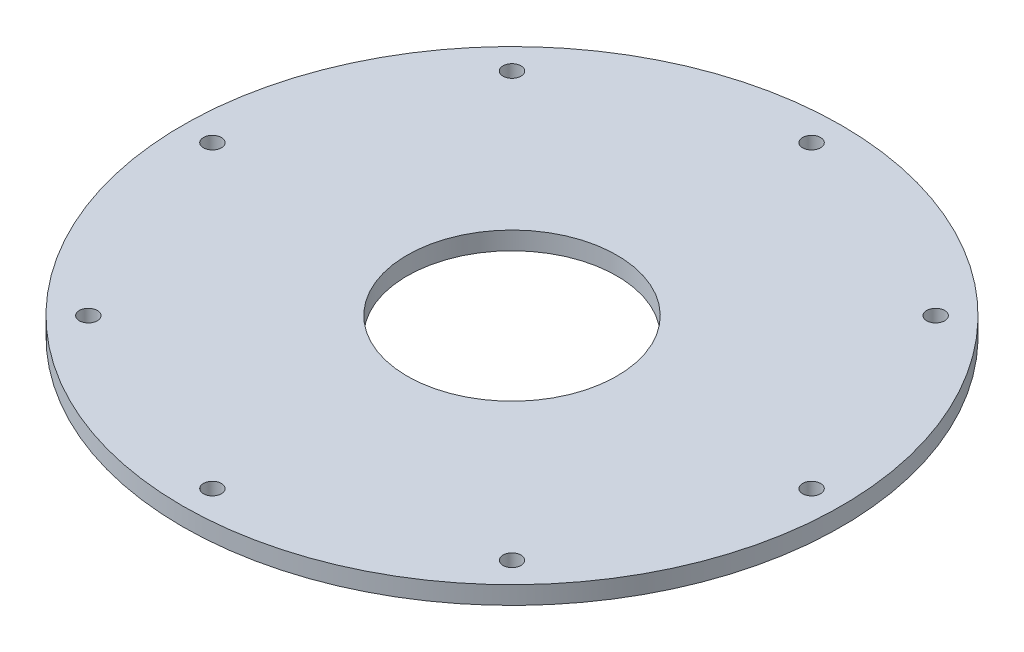
ISO-10303-21;
HEADER;
FILE_DESCRIPTION(('STEP AP214'),'2;1');
FILE_NAME('part.step','',(''),(''),'','','');
FILE_SCHEMA(('AUTOMOTIVE_DESIGN { 1 0 10303 214 1 1 1 1 }'));
ENDSEC;
DATA;
#1=APPLICATION_CONTEXT('core data for automotive mechanical design processes');
#2=APPLICATION_PROTOCOL_DEFINITION('international standard','automotive_design',2000,#1);
#3=PRODUCT_CONTEXT('',#1,'mechanical');
#4=PRODUCT('Part','Part','',(#3));
#5=PRODUCT_RELATED_PRODUCT_CATEGORY('part','',(#4));
#6=PRODUCT_DEFINITION_FORMATION('','',#4);
#7=PRODUCT_DEFINITION_CONTEXT('part definition',#1,'design');
#8=PRODUCT_DEFINITION('design','',#6,#7);
#9=PRODUCT_DEFINITION_SHAPE('','',#8);
#10=(LENGTH_UNIT() NAMED_UNIT(*) SI_UNIT(.MILLI.,.METRE.));
#11=(NAMED_UNIT(*) PLANE_ANGLE_UNIT() SI_UNIT($,.RADIAN.));
#12=(NAMED_UNIT(*) SI_UNIT($,.STERADIAN.) SOLID_ANGLE_UNIT());
#13=UNCERTAINTY_MEASURE_WITH_UNIT(LENGTH_MEASURE(1.E-05),#10,'distance_accuracy_value','');
#14=(GEOMETRIC_REPRESENTATION_CONTEXT(3) GLOBAL_UNCERTAINTY_ASSIGNED_CONTEXT((#13)) GLOBAL_UNIT_ASSIGNED_CONTEXT((#10,
#11,#12)) REPRESENTATION_CONTEXT('',''));
#15=CARTESIAN_POINT('',(0.,0.,0.));
#16=DIRECTION('',(0.,0.,1.));
#17=DIRECTION('',(1.,0.,0.));
#18=AXIS2_PLACEMENT_3D('',#15,#16,#17);
#19=CARTESIAN_POINT('',(0.,3.,0.));
#20=DIRECTION('',(0.,-1.,0.));
#21=DIRECTION('',(0.,0.,-1.));
#22=AXIS2_PLACEMENT_3D('',#19,#20,#21);
#23=CYLINDRICAL_SURFACE('',#22,55.);
#24=CARTESIAN_POINT('',(0.,3.,0.));
#25=DIRECTION('',(0.,1.,0.));
#26=DIRECTION('',(0.,0.,1.));
#27=AXIS2_PLACEMENT_3D('',#24,#25,#26);
#28=CIRCLE('',#27,55.);
#29=CARTESIAN_POINT('',(0.,3.,55.));
#30=VERTEX_POINT('',#29);
#31=EDGE_CURVE('E10',#30,#30,#28,.T.);
#32=ORIENTED_EDGE('',*,*,#31,.F.);
#33=EDGE_LOOP('',(#32));
#34=FACE_BOUND('',#33,.T.);
#35=CARTESIAN_POINT('',(0.,0.,0.));
#36=DIRECTION('',(0.,1.,0.));
#37=DIRECTION('',(0.,0.,1.));
#38=AXIS2_PLACEMENT_3D('',#35,#36,#37);
#39=CIRCLE('',#38,55.);
#40=CARTESIAN_POINT('',(0.,0.,55.));
#41=VERTEX_POINT('',#40);
#42=EDGE_CURVE('E46',#41,#41,#39,.T.);
#43=ORIENTED_EDGE('',*,*,#42,.T.);
#44=EDGE_LOOP('',(#43));
#45=FACE_BOUND('',#44,.T.);
#46=ADVANCED_FACE('F43',(#34,#45),#23,.T.);
#47=CARTESIAN_POINT('',(0.,3.,0.));
#48=DIRECTION('',(0.,1.,0.));
#49=DIRECTION('',(0.,0.,1.));
#50=AXIS2_PLACEMENT_3D('',#47,#48,#49);
#51=PLANE('',#50);
#52=CARTESIAN_POINT('',(-50.,3.,1.74574066942157E-13));
#53=DIRECTION('',(0.,1.,0.));
#54=DIRECTION('',(1.,0.,0.));
#55=AXIS2_PLACEMENT_3D('',#52,#53,#54);
#56=CIRCLE('',#55,1.5);
#57=CARTESIAN_POINT('',(-48.5,3.,1.69336844933892E-13));
#58=VERTEX_POINT('',#57);
#59=EDGE_CURVE('E106',#58,#58,#56,.T.);
#60=ORIENTED_EDGE('',*,*,#59,.F.);
#61=EDGE_LOOP('',(#60));
#62=FACE_BOUND('',#61,.T.);
#63=CARTESIAN_POINT('',(-35.3553390593272,3.,35.3553390593276));
#64=DIRECTION('',(0.,1.,0.));
#65=DIRECTION('',(0.707106781186544,0.,-0.707106781186551));
#66=AXIS2_PLACEMENT_3D('',#63,#64,#65);
#67=CIRCLE('',#66,1.5);
#68=CARTESIAN_POINT('',(-34.2946788875474,3.,34.2946788875477));
#69=VERTEX_POINT('',#68);
#70=EDGE_CURVE('E98',#69,#69,#67,.T.);
#71=ORIENTED_EDGE('',*,*,#70,.F.);
#72=EDGE_LOOP('',(#71));
#73=FACE_BOUND('',#72,.T.);
#74=CARTESIAN_POINT('',(0.,3.,50.));
#75=DIRECTION('',(0.,1.,0.));
#76=DIRECTION('',(0.,0.,-1.));
#77=AXIS2_PLACEMENT_3D('',#74,#75,#76);
#78=CIRCLE('',#77,1.5);
#79=CARTESIAN_POINT('',(0.,3.,48.5));
#80=VERTEX_POINT('',#79);
#81=EDGE_CURVE('E90',#80,#80,#78,.T.);
#82=ORIENTED_EDGE('',*,*,#81,.F.);
#83=EDGE_LOOP('',(#82));
#84=FACE_BOUND('',#83,.T.);
#85=CARTESIAN_POINT('',(35.3553390593277,3.,35.3553390593271));
#86=DIRECTION('',(0.,1.,0.));
#87=DIRECTION('',(-0.707106781186554,0.,-0.707106781186541));
#88=AXIS2_PLACEMENT_3D('',#85,#86,#87);
#89=CIRCLE('',#88,1.5);
#90=CARTESIAN_POINT('',(34.2946788875479,3.,34.2946788875473));
#91=VERTEX_POINT('',#90);
#92=EDGE_CURVE('E81',#91,#91,#89,.T.);
#93=ORIENTED_EDGE('',*,*,#92,.F.);
#94=EDGE_LOOP('',(#93));
#95=FACE_BOUND('',#94,.T.);
#96=CARTESIAN_POINT('',(50.,3.,-5.2372220082647E-13));
#97=DIRECTION('',(0.,1.,0.));
#98=DIRECTION('',(-1.,0.,0.));
#99=AXIS2_PLACEMENT_3D('',#96,#97,#98);
#100=CIRCLE('',#99,1.5);
#101=CARTESIAN_POINT('',(48.5,3.,-5.08010534801676E-13));
#102=VERTEX_POINT('',#101);
#103=EDGE_CURVE('E121',#102,#102,#100,.T.);
#104=ORIENTED_EDGE('',*,*,#103,.F.);
#105=EDGE_LOOP('',(#104));
#106=FACE_BOUND('',#105,.T.);
#107=CARTESIAN_POINT('',(35.3553390593269,3.,-35.3553390593278));
#108=DIRECTION('',(0.,1.,0.));
#109=DIRECTION('',(-0.707106781186539,0.,0.707106781186556));
#110=AXIS2_PLACEMENT_3D('',#107,#108,#109);
#111=CIRCLE('',#110,1.5);
#112=CARTESIAN_POINT('',(34.2946788875471,3.,-34.294678887548));
#113=VERTEX_POINT('',#112);
#114=EDGE_CURVE('E113',#113,#113,#111,.T.);
#115=ORIENTED_EDGE('',*,*,#114,.F.);
#116=EDGE_LOOP('',(#115));
#117=FACE_BOUND('',#116,.T.);
#118=CARTESIAN_POINT('',(-35.3553390593274,3.,-35.3553390593273));
#119=DIRECTION('',(0.,1.,0.));
#120=DIRECTION('',(0.707106781186549,0.,0.707106781186546));
#121=AXIS2_PLACEMENT_3D('',#118,#119,#120);
#122=CIRCLE('',#121,1.5);
#123=CARTESIAN_POINT('',(-34.2946788875476,3.,-34.2946788875475));
#124=VERTEX_POINT('',#123);
#125=EDGE_CURVE('E73',#124,#124,#122,.T.);
#126=ORIENTED_EDGE('',*,*,#125,.F.);
#127=EDGE_LOOP('',(#126));
#128=FACE_BOUND('',#127,.T.);
#129=CARTESIAN_POINT('',(0.,3.,-50.));
#130=DIRECTION('',(0.,1.,0.));
#131=DIRECTION('',(0.,0.,1.));
#132=AXIS2_PLACEMENT_3D('',#129,#130,#131);
#133=CIRCLE('',#132,1.5);
#134=CARTESIAN_POINT('',(0.,3.,-48.5));
#135=VERTEX_POINT('',#134);
#136=EDGE_CURVE('E65',#135,#135,#133,.T.);
#137=ORIENTED_EDGE('',*,*,#136,.F.);
#138=EDGE_LOOP('',(#137));
#139=FACE_BOUND('',#138,.T.);
#140=CARTESIAN_POINT('',(0.,3.,0.));
#141=DIRECTION('',(0.,1.,0.));
#142=DIRECTION('',(0.,0.,1.));
#143=AXIS2_PLACEMENT_3D('',#140,#141,#142);
#144=CIRCLE('',#143,17.5);
#145=CARTESIAN_POINT('',(0.,3.,17.5));
#146=VERTEX_POINT('',#145);
#147=EDGE_CURVE('E57',#146,#146,#144,.T.);
#148=ORIENTED_EDGE('',*,*,#147,.F.);
#149=EDGE_LOOP('',(#148));
#150=FACE_BOUND('',#149,.T.);
#151=ORIENTED_EDGE('',*,*,#31,.T.);
#152=EDGE_LOOP('',(#151));
#153=FACE_BOUND('',#152,.T.);
#154=ADVANCED_FACE('F140',(#62,#73,#84,#95,#106,#117,#128,#139,#150,#153),#51,.T.);
#155=CARTESIAN_POINT('',(0.,0.,0.));
#156=DIRECTION('',(0.,1.,0.));
#157=DIRECTION('',(0.,0.,1.));
#158=AXIS2_PLACEMENT_3D('',#155,#156,#157);
#159=PLANE('',#158);
#160=CARTESIAN_POINT('',(-50.,0.,1.74574066942157E-13));
#161=DIRECTION('',(0.,1.,0.));
#162=DIRECTION('',(1.,0.,0.));
#163=AXIS2_PLACEMENT_3D('',#160,#161,#162);
#164=CIRCLE('',#163,1.5);
#165=CARTESIAN_POINT('',(-48.5,0.,1.69336844933892E-13));
#166=VERTEX_POINT('',#165);
#167=EDGE_CURVE('E77',#166,#166,#164,.T.);
#168=ORIENTED_EDGE('',*,*,#167,.T.);
#169=EDGE_LOOP('',(#168));
#170=FACE_BOUND('',#169,.T.);
#171=CARTESIAN_POINT('',(-35.3553390593272,0.,35.3553390593276));
#172=DIRECTION('',(0.,1.,0.));
#173=DIRECTION('',(0.707106781186544,0.,-0.707106781186551));
#174=AXIS2_PLACEMENT_3D('',#171,#172,#173);
#175=CIRCLE('',#174,1.5);
#176=CARTESIAN_POINT('',(-34.2946788875474,0.,34.2946788875477));
#177=VERTEX_POINT('',#176);
#178=EDGE_CURVE('E102',#177,#177,#175,.T.);
#179=ORIENTED_EDGE('',*,*,#178,.T.);
#180=EDGE_LOOP('',(#179));
#181=FACE_BOUND('',#180,.T.);
#182=CARTESIAN_POINT('',(0.,0.,50.));
#183=DIRECTION('',(0.,1.,0.));
#184=DIRECTION('',(0.,0.,-1.));
#185=AXIS2_PLACEMENT_3D('',#182,#183,#184);
#186=CIRCLE('',#185,1.5);
#187=CARTESIAN_POINT('',(0.,0.,48.5));
#188=VERTEX_POINT('',#187);
#189=EDGE_CURVE('E94',#188,#188,#186,.T.);
#190=ORIENTED_EDGE('',*,*,#189,.T.);
#191=EDGE_LOOP('',(#190));
#192=FACE_BOUND('',#191,.T.);
#193=CARTESIAN_POINT('',(35.3553390593277,0.,35.3553390593271));
#194=DIRECTION('',(0.,1.,0.));
#195=DIRECTION('',(-0.707106781186554,0.,-0.707106781186541));
#196=AXIS2_PLACEMENT_3D('',#193,#194,#195);
#197=CIRCLE('',#196,1.5);
#198=CARTESIAN_POINT('',(34.2946788875479,0.,34.2946788875473));
#199=VERTEX_POINT('',#198);
#200=EDGE_CURVE('E85',#199,#199,#197,.T.);
#201=ORIENTED_EDGE('',*,*,#200,.T.);
#202=EDGE_LOOP('',(#201));
#203=FACE_BOUND('',#202,.T.);
#204=CARTESIAN_POINT('',(50.,0.,-5.2372220082647E-13));
#205=DIRECTION('',(0.,1.,0.));
#206=DIRECTION('',(-1.,0.,0.));
#207=AXIS2_PLACEMENT_3D('',#204,#205,#206);
#208=CIRCLE('',#207,1.5);
#209=CARTESIAN_POINT('',(48.5,0.,-5.08010534801676E-13));
#210=VERTEX_POINT('',#209);
#211=EDGE_CURVE('E86',#210,#210,#208,.T.);
#212=ORIENTED_EDGE('',*,*,#211,.T.);
#213=EDGE_LOOP('',(#212));
#214=FACE_BOUND('',#213,.T.);
#215=CARTESIAN_POINT('',(35.3553390593269,0.,-35.3553390593278));
#216=DIRECTION('',(0.,1.,0.));
#217=DIRECTION('',(-0.707106781186539,0.,0.707106781186556));
#218=AXIS2_PLACEMENT_3D('',#215,#216,#217);
#219=CIRCLE('',#218,1.5);
#220=CARTESIAN_POINT('',(34.2946788875471,0.,-34.294678887548));
#221=VERTEX_POINT('',#220);
#222=EDGE_CURVE('E117',#221,#221,#219,.T.);
#223=ORIENTED_EDGE('',*,*,#222,.T.);
#224=EDGE_LOOP('',(#223));
#225=FACE_BOUND('',#224,.T.);
#226=CARTESIAN_POINT('',(-35.3553390593274,0.,-35.3553390593273));
#227=DIRECTION('',(0.,1.,0.));
#228=DIRECTION('',(0.707106781186549,0.,0.707106781186546));
#229=AXIS2_PLACEMENT_3D('',#226,#227,#228);
#230=CIRCLE('',#229,1.5);
#231=CARTESIAN_POINT('',(-34.2946788875476,0.,-34.2946788875475));
#232=VERTEX_POINT('',#231);
#233=EDGE_CURVE('E69',#232,#232,#230,.T.);
#234=ORIENTED_EDGE('',*,*,#233,.T.);
#235=EDGE_LOOP('',(#234));
#236=FACE_BOUND('',#235,.T.);
#237=CARTESIAN_POINT('',(0.,0.,-50.));
#238=DIRECTION('',(0.,1.,0.));
#239=DIRECTION('',(0.,0.,1.));
#240=AXIS2_PLACEMENT_3D('',#237,#238,#239);
#241=CIRCLE('',#240,1.5);
#242=CARTESIAN_POINT('',(0.,0.,-48.5));
#243=VERTEX_POINT('',#242);
#244=EDGE_CURVE('E61',#243,#243,#241,.T.);
#245=ORIENTED_EDGE('',*,*,#244,.T.);
#246=EDGE_LOOP('',(#245));
#247=FACE_BOUND('',#246,.T.);
#248=CARTESIAN_POINT('',(0.,0.,0.));
#249=DIRECTION('',(0.,1.,0.));
#250=DIRECTION('',(0.,0.,1.));
#251=AXIS2_PLACEMENT_3D('',#248,#249,#250);
#252=CIRCLE('',#251,17.5);
#253=CARTESIAN_POINT('',(0.,0.,17.5));
#254=VERTEX_POINT('',#253);
#255=EDGE_CURVE('E55',#254,#254,#252,.T.);
#256=ORIENTED_EDGE('',*,*,#255,.T.);
#257=EDGE_LOOP('',(#256));
#258=FACE_BOUND('',#257,.T.);
#259=ORIENTED_EDGE('',*,*,#42,.F.);
#260=EDGE_LOOP('',(#259));
#261=FACE_BOUND('',#260,.T.);
#262=ADVANCED_FACE('F129',(#170,#181,#192,#203,#214,#225,#236,#247,#258,#261),#159,.F.);
#263=CARTESIAN_POINT('',(0.,0.,0.));
#264=DIRECTION('',(0.,1.,0.));
#265=DIRECTION('',(0.,0.,1.));
#266=AXIS2_PLACEMENT_3D('',#263,#264,#265);
#267=CYLINDRICAL_SURFACE('',#266,17.5);
#268=ORIENTED_EDGE('',*,*,#255,.F.);
#269=EDGE_LOOP('',(#268));
#270=FACE_BOUND('',#269,.T.);
#271=ORIENTED_EDGE('',*,*,#147,.T.);
#272=EDGE_LOOP('',(#271));
#273=FACE_BOUND('',#272,.T.);
#274=ADVANCED_FACE('F153',(#270,#273),#267,.F.);
#275=CARTESIAN_POINT('',(0.,0.,-50.));
#276=DIRECTION('',(0.,1.,0.));
#277=DIRECTION('',(0.,0.,1.));
#278=AXIS2_PLACEMENT_3D('',#275,#276,#277);
#279=CYLINDRICAL_SURFACE('',#278,1.5);
#280=ORIENTED_EDGE('',*,*,#244,.F.);
#281=EDGE_LOOP('',(#280));
#282=FACE_BOUND('',#281,.T.);
#283=ORIENTED_EDGE('',*,*,#136,.T.);
#284=EDGE_LOOP('',(#283));
#285=FACE_BOUND('',#284,.T.);
#286=ADVANCED_FACE('F155',(#282,#285),#279,.F.);
#287=CARTESIAN_POINT('',(-35.3553390593274,0.,-35.3553390593273));
#288=DIRECTION('',(0.,1.,0.));
#289=DIRECTION('',(0.,0.,1.));
#290=AXIS2_PLACEMENT_3D('',#287,#288,#289);
#291=CYLINDRICAL_SURFACE('',#290,1.5);
#292=ORIENTED_EDGE('',*,*,#233,.F.);
#293=EDGE_LOOP('',(#292));
#294=FACE_BOUND('',#293,.T.);
#295=ORIENTED_EDGE('',*,*,#125,.T.);
#296=EDGE_LOOP('',(#295));
#297=FACE_BOUND('',#296,.T.);
#298=ADVANCED_FACE('F162',(#294,#297),#291,.F.);
#299=CARTESIAN_POINT('',(35.3553390593269,0.,-35.3553390593278));
#300=DIRECTION('',(0.,1.,0.));
#301=DIRECTION('',(0.,0.,1.));
#302=AXIS2_PLACEMENT_3D('',#299,#300,#301);
#303=CYLINDRICAL_SURFACE('',#302,1.5);
#304=ORIENTED_EDGE('',*,*,#222,.F.);
#305=EDGE_LOOP('',(#304));
#306=FACE_BOUND('',#305,.T.);
#307=ORIENTED_EDGE('',*,*,#114,.T.);
#308=EDGE_LOOP('',(#307));
#309=FACE_BOUND('',#308,.T.);
#310=ADVANCED_FACE('F136',(#306,#309),#303,.F.);
#311=CARTESIAN_POINT('',(50.,0.,-5.2372220082647E-13));
#312=DIRECTION('',(0.,1.,0.));
#313=DIRECTION('',(0.,0.,1.));
#314=AXIS2_PLACEMENT_3D('',#311,#312,#313);
#315=CYLINDRICAL_SURFACE('',#314,1.5);
#316=ORIENTED_EDGE('',*,*,#211,.F.);
#317=EDGE_LOOP('',(#316));
#318=FACE_BOUND('',#317,.T.);
#319=ORIENTED_EDGE('',*,*,#103,.T.);
#320=EDGE_LOOP('',(#319));
#321=FACE_BOUND('',#320,.T.);
#322=ADVANCED_FACE('F132',(#318,#321),#315,.F.);
#323=CARTESIAN_POINT('',(35.3553390593277,0.,35.3553390593271));
#324=DIRECTION('',(0.,1.,0.));
#325=DIRECTION('',(0.,0.,1.));
#326=AXIS2_PLACEMENT_3D('',#323,#324,#325);
#327=CYLINDRICAL_SURFACE('',#326,1.5);
#328=ORIENTED_EDGE('',*,*,#200,.F.);
#329=EDGE_LOOP('',(#328));
#330=FACE_BOUND('',#329,.T.);
#331=ORIENTED_EDGE('',*,*,#92,.T.);
#332=EDGE_LOOP('',(#331));
#333=FACE_BOUND('',#332,.T.);
#334=ADVANCED_FACE('F135',(#330,#333),#327,.F.);
#335=CARTESIAN_POINT('',(0.,0.,50.));
#336=DIRECTION('',(0.,1.,0.));
#337=DIRECTION('',(0.,0.,1.));
#338=AXIS2_PLACEMENT_3D('',#335,#336,#337);
#339=CYLINDRICAL_SURFACE('',#338,1.5);
#340=ORIENTED_EDGE('',*,*,#189,.F.);
#341=EDGE_LOOP('',(#340));
#342=FACE_BOUND('',#341,.T.);
#343=ORIENTED_EDGE('',*,*,#81,.T.);
#344=EDGE_LOOP('',(#343));
#345=FACE_BOUND('',#344,.T.);
#346=ADVANCED_FACE('F230',(#342,#345),#339,.F.);
#347=CARTESIAN_POINT('',(-35.3553390593272,0.,35.3553390593276));
#348=DIRECTION('',(0.,1.,0.));
#349=DIRECTION('',(0.,0.,1.));
#350=AXIS2_PLACEMENT_3D('',#347,#348,#349);
#351=CYLINDRICAL_SURFACE('',#350,1.5);
#352=ORIENTED_EDGE('',*,*,#178,.F.);
#353=EDGE_LOOP('',(#352));
#354=FACE_BOUND('',#353,.T.);
#355=ORIENTED_EDGE('',*,*,#70,.T.);
#356=EDGE_LOOP('',(#355));
#357=FACE_BOUND('',#356,.T.);
#358=ADVANCED_FACE('F240',(#354,#357),#351,.F.);
#359=CARTESIAN_POINT('',(-50.,0.,1.74574066942157E-13));
#360=DIRECTION('',(0.,1.,0.));
#361=DIRECTION('',(0.,0.,1.));
#362=AXIS2_PLACEMENT_3D('',#359,#360,#361);
#363=CYLINDRICAL_SURFACE('',#362,1.5);
#364=ORIENTED_EDGE('',*,*,#167,.F.);
#365=EDGE_LOOP('',(#364));
#366=FACE_BOUND('',#365,.T.);
#367=ORIENTED_EDGE('',*,*,#59,.T.);
#368=EDGE_LOOP('',(#367));
#369=FACE_BOUND('',#368,.T.);
#370=ADVANCED_FACE('F250',(#366,#369),#363,.F.);
#371=CLOSED_SHELL('',(#46,#154,#262,#274,#286,#298,#310,#322,#334,#346,#358,#370));
#372=MANIFOLD_SOLID_BREP('B2',#371);
#373=ADVANCED_BREP_SHAPE_REPRESENTATION('',(#18,#372),#14);
#374=SHAPE_DEFINITION_REPRESENTATION(#9,#373);
ENDSEC;
END-ISO-10303-21;
